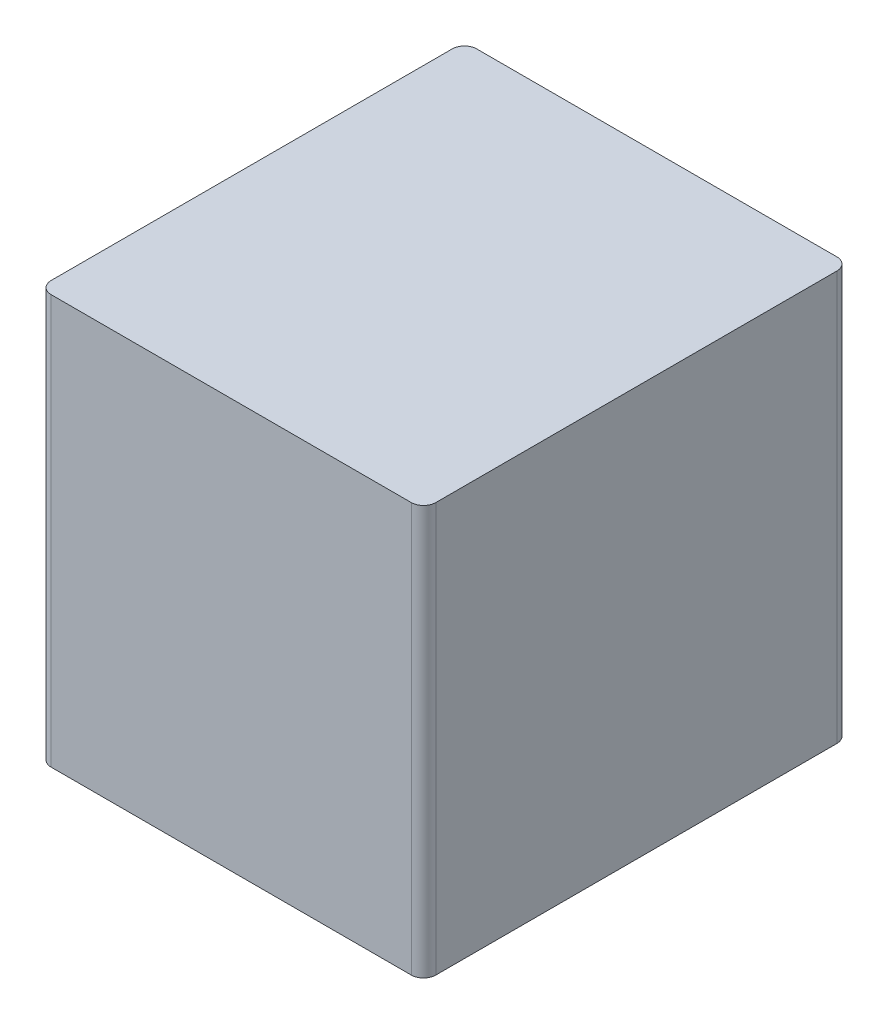
ISO-10303-21;
HEADER;
FILE_DESCRIPTION(('STEP AP214'),'2;1');
FILE_NAME('part.step','',(''),(''),'','','');
FILE_SCHEMA(('AUTOMOTIVE_DESIGN { 1 0 10303 214 1 1 1 1 }'));
ENDSEC;
DATA;
#1=APPLICATION_CONTEXT('core data for automotive mechanical design processes');
#2=APPLICATION_PROTOCOL_DEFINITION('international standard','automotive_design',2000,#1);
#3=PRODUCT_CONTEXT('',#1,'mechanical');
#4=PRODUCT('Part','Part','',(#3));
#5=PRODUCT_RELATED_PRODUCT_CATEGORY('part','',(#4));
#6=PRODUCT_DEFINITION_FORMATION('','',#4);
#7=PRODUCT_DEFINITION_CONTEXT('part definition',#1,'design');
#8=PRODUCT_DEFINITION('design','',#6,#7);
#9=PRODUCT_DEFINITION_SHAPE('','',#8);
#10=(LENGTH_UNIT() NAMED_UNIT(*) SI_UNIT(.MILLI.,.METRE.));
#11=(NAMED_UNIT(*) PLANE_ANGLE_UNIT() SI_UNIT($,.RADIAN.));
#12=(NAMED_UNIT(*) SI_UNIT($,.STERADIAN.) SOLID_ANGLE_UNIT());
#13=UNCERTAINTY_MEASURE_WITH_UNIT(LENGTH_MEASURE(1.E-05),#10,'distance_accuracy_value','');
#14=(GEOMETRIC_REPRESENTATION_CONTEXT(3) GLOBAL_UNCERTAINTY_ASSIGNED_CONTEXT((#13)) GLOBAL_UNIT_ASSIGNED_CONTEXT((#10,
#11,#12)) REPRESENTATION_CONTEXT('',''));
#15=CARTESIAN_POINT('',(0.,0.,0.));
#16=DIRECTION('',(0.,0.,1.));
#17=DIRECTION('',(1.,0.,0.));
#18=AXIS2_PLACEMENT_3D('',#15,#16,#17);
#19=CARTESIAN_POINT('',(10.779999342974,-11.75000065475,-1.641602046084));
#20=DIRECTION('',(-1.19248806385E-08,-0.999999999999996,-8.74227765734797E-08));
#21=DIRECTION('',(0.,8.74227765734797E-08,-0.999999999999996));
#22=AXIS2_PLACEMENT_3D('',#19,#20,#21);
#23=CYLINDRICAL_SURFACE('',#22,0.015);
#24=CARTESIAN_POINT('',(10.779999342974,-11.7500006547487,-1.641602046084));
#25=DIRECTION('',(-1.19248806385E-08,-0.999999999999996,-8.74227765734797E-08));
#26=DIRECTION('',(0.,8.74227765734797E-08,-0.999999999999996));
#27=AXIS2_PLACEMENT_3D('',#24,#25,#26);
#28=CIRCLE('',#27,0.015);
#29=CARTESIAN_POINT('',(10.779999342974,-11.7500006560582,-1.626602046084));
#30=VERTEX_POINT('',#29);
#31=CARTESIAN_POINT('',(10.764999342974,-11.750000654568,-1.64160206794));
#32=VERTEX_POINT('',#31);
#33=EDGE_CURVE('E117',#30,#32,#28,.T.);
#34=ORIENTED_EDGE('',*,*,#33,.T.);
#35=DIRECTION('',(-1.19248806385E-08,-1.,0.));
#36=VECTOR('',#35,1.);
#37=CARTESIAN_POINT('',(10.764999342974,-11.75000065588,-1.641602089796));
#38=LINE('',#37,#36);
#39=CARTESIAN_POINT('',(10.7649993370111,-12.2500006545681,-1.64160208979569));
#40=VERTEX_POINT('',#39);
#41=EDGE_CURVE('E138',#40,#32,#38,.F.);
#42=ORIENTED_EDGE('',*,*,#41,.F.);
#43=CARTESIAN_POINT('',(10.7799993370116,-12.2500006547489,-1.64160208979539));
#44=DIRECTION('',(-1.19248806385E-08,-0.999999999999996,-8.74227765734797E-08));
#45=DIRECTION('',(0.,8.74227765734797E-08,-0.999999999999996));
#46=AXIS2_PLACEMENT_3D('',#43,#44,#45);
#47=CIRCLE('',#46,0.015);
#48=CARTESIAN_POINT('',(10.7799993399925,-12.2500006560583,-1.62660208979554));
#49=VERTEX_POINT('',#48);
#50=EDGE_CURVE('E107',#49,#40,#47,.T.);
#51=ORIENTED_EDGE('',*,*,#50,.F.);
#52=DIRECTION('',(0.,-0.999999999999996,-8.74227765734797E-08));
#53=VECTOR('',#52,1.);
#54=CARTESIAN_POINT('',(10.779999342974,-11.75000066149,-1.626602046084));
#55=LINE('',#54,#53);
#56=EDGE_CURVE('E90',#30,#49,#55,.T.);
#57=ORIENTED_EDGE('',*,*,#56,.F.);
#58=EDGE_LOOP('',(#34,#42,#51,#57));
#59=FACE_BOUND('',#58,.T.);
#60=ADVANCED_FACE('F17',(#59),#23,.T.);
#61=CARTESIAN_POINT('',(10.764999342974,-11.75000065588,-1.626602046084));
#62=DIRECTION('',(-1.,1.19248806385E-08,0.));
#63=DIRECTION('',(-1.19248806385E-08,-1.,0.));
#64=AXIS2_PLACEMENT_3D('',#61,#62,#63);
#65=PLANE('',#64);
#66=DIRECTION('',(-1.19248806385E-08,-0.999999999999996,-8.74227765734797E-08));
#67=VECTOR('',#66,1.);
#68=CARTESIAN_POINT('',(10.764999342974,-11.7500006117311,-2.13160204606461));
#69=LINE('',#68,#67);
#70=CARTESIAN_POINT('',(10.7649993370111,-12.2500006117308,-2.13160208977569));
#71=VERTEX_POINT('',#70);
#72=CARTESIAN_POINT('',(10.764999342974,-11.7500006117295,-2.13160204606431));
#73=VERTEX_POINT('',#72);
#74=EDGE_CURVE('E91',#71,#73,#69,.F.);
#75=ORIENTED_EDGE('',*,*,#74,.F.);
#76=DIRECTION('',(0.,8.74227765734797E-08,-0.999999999999996));
#77=VECTOR('',#76,1.);
#78=CARTESIAN_POINT('',(10.764999337011,-12.2500006331477,-1.886602089803));
#79=LINE('',#78,#77);
#80=EDGE_CURVE('E105',#40,#71,#79,.T.);
#81=ORIENTED_EDGE('',*,*,#80,.F.);
#82=ORIENTED_EDGE('',*,*,#41,.T.);
#83=DIRECTION('',(0.,8.74227765734797E-08,-0.999999999999996));
#84=VECTOR('',#83,1.);
#85=CARTESIAN_POINT('',(10.764999342974,-11.7500006331477,-1.886602046092));
#86=LINE('',#85,#84);
#87=EDGE_CURVE('E124',#32,#73,#86,.T.);
#88=ORIENTED_EDGE('',*,*,#87,.T.);
#89=EDGE_LOOP('',(#75,#81,#82,#88));
#90=FACE_BOUND('',#89,.T.);
#91=ADVANCED_FACE('F182',(#90),#65,.T.);
#92=CARTESIAN_POINT('',(10.779999342974,-11.75000061191,-2.131602046064));
#93=DIRECTION('',(-1.19248806385E-08,-0.999999999999996,-8.74227765734797E-08));
#94=DIRECTION('',(0.,8.74227765734797E-08,-0.999999999999996));
#95=AXIS2_PLACEMENT_3D('',#92,#93,#94);
#96=CYLINDRICAL_SURFACE('',#95,0.015);
#97=CARTESIAN_POINT('',(10.779999342974,-11.7500006119089,-2.131602046064));
#98=DIRECTION('',(-1.19248806385E-08,-0.999999999999996,-8.74227765734797E-08));
#99=DIRECTION('',(0.,8.74227765734797E-08,-0.999999999999996));
#100=AXIS2_PLACEMENT_3D('',#97,#98,#99);
#101=CIRCLE('',#100,0.015);
#102=CARTESIAN_POINT('',(10.7799993399925,-11.7500006105971,-2.146602046064));
#103=VERTEX_POINT('',#102);
#104=EDGE_CURVE('E87',#73,#103,#101,.T.);
#105=ORIENTED_EDGE('',*,*,#104,.T.);
#106=DIRECTION('',(0.,0.999999999999996,8.74227765734797E-08));
#107=VECTOR('',#106,1.);
#108=CARTESIAN_POINT('',(10.779999337011,-11.75000061042,-2.146602046064));
#109=LINE('',#108,#107);
#110=CARTESIAN_POINT('',(10.7799993370113,-12.2500006105983,-2.14660208977585));
#111=VERTEX_POINT('',#110);
#112=EDGE_CURVE('E20',#111,#103,#109,.T.);
#113=ORIENTED_EDGE('',*,*,#112,.F.);
#114=CARTESIAN_POINT('',(10.7799993370116,-12.2500006119113,-2.13160208977539));
#115=DIRECTION('',(-1.19248806385E-08,-0.999999999999996,-8.74227765734797E-08));
#116=DIRECTION('',(0.,8.74227765734797E-08,-0.999999999999996));
#117=AXIS2_PLACEMENT_3D('',#114,#115,#116);
#118=CIRCLE('',#117,0.015);
#119=EDGE_CURVE('E84',#71,#111,#118,.T.);
#120=ORIENTED_EDGE('',*,*,#119,.F.);
#121=ORIENTED_EDGE('',*,*,#74,.T.);
#122=EDGE_LOOP('',(#105,#113,#120,#121));
#123=FACE_BOUND('',#122,.T.);
#124=ADVANCED_FACE('F81',(#123),#96,.T.);
#125=CARTESIAN_POINT('',(10.764999342974,-11.75000061042,-2.146602046064));
#126=DIRECTION('',(0.,8.74227765734797E-08,-0.999999999999996));
#127=DIRECTION('',(0.,0.999999999999996,8.74227765734797E-08));
#128=AXIS2_PLACEMENT_3D('',#125,#126,#127);
#129=PLANE('',#128);
#130=DIRECTION('',(0.,0.999999999999996,8.74227765734797E-08));
#131=VECTOR('',#130,1.);
#132=CARTESIAN_POINT('',(11.219999343003,-11.75000061042,-2.146602046064));
#133=LINE('',#132,#131);
#134=CARTESIAN_POINT('',(11.2199993400218,-12.2500006158467,-2.14660208977585));
#135=VERTEX_POINT('',#134);
#136=CARTESIAN_POINT('',(11.219999343003,-11.7500006158468,-2.146602046064));
#137=VERTEX_POINT('',#136);
#138=EDGE_CURVE('E96',#135,#137,#133,.T.);
#139=ORIENTED_EDGE('',*,*,#138,.F.);
#140=DIRECTION('',(1.,-1.19248806384999E-08,0.));
#141=VECTOR('',#140,1.);
#142=CARTESIAN_POINT('',(10.999999337019,-12.2500006132201,-2.146602089776));
#143=LINE('',#142,#141);
#144=EDGE_CURVE('E93',#111,#135,#143,.T.);
#145=ORIENTED_EDGE('',*,*,#144,.F.);
#146=ORIENTED_EDGE('',*,*,#112,.T.);
#147=DIRECTION('',(1.,-1.19248806384999E-08,0.));
#148=VECTOR('',#147,1.);
#149=CARTESIAN_POINT('',(10.999999342981,-11.7500006132201,-2.146602046064));
#150=LINE('',#149,#148);
#151=EDGE_CURVE('E123',#103,#137,#150,.T.);
#152=ORIENTED_EDGE('',*,*,#151,.T.);
#153=EDGE_LOOP('',(#139,#145,#146,#152));
#154=FACE_BOUND('',#153,.T.);
#155=ADVANCED_FACE('F94',(#154),#129,.T.);
#156=CARTESIAN_POINT('',(11.234999343003,-11.75000066149,-1.626602046084));
#157=DIRECTION('',(0.,-8.74227765734797E-08,0.999999999999996));
#158=DIRECTION('',(0.,-0.999999999999996,-8.74227765734797E-08));
#159=AXIS2_PLACEMENT_3D('',#156,#157,#158);
#160=PLANE('',#159);
#161=DIRECTION('',(-1.19248806385E-08,-0.999999999999996,-8.74227765734797E-08));
#162=VECTOR('',#161,1.);
#163=CARTESIAN_POINT('',(11.219999343003,-11.7500006613113,-1.626602046084));
#164=LINE('',#163,#162);
#165=CARTESIAN_POINT('',(11.219999343003,-11.7500006613079,-1.626602046084));
#166=VERTEX_POINT('',#165);
#167=CARTESIAN_POINT('',(11.2199993370406,-12.2500006613067,-1.62660208979554));
#168=VERTEX_POINT('',#167);
#169=EDGE_CURVE('E113',#166,#168,#164,.T.);
#170=ORIENTED_EDGE('',*,*,#169,.F.);
#171=DIRECTION('',(1.,-1.19248806384999E-08,0.));
#172=VECTOR('',#171,1.);
#173=CARTESIAN_POINT('',(10.999999342981,-11.7500006586799,-1.626602046084));
#174=LINE('',#173,#172);
#175=EDGE_CURVE('E120',#166,#30,#174,.F.);
#176=ORIENTED_EDGE('',*,*,#175,.T.);
#177=ORIENTED_EDGE('',*,*,#56,.T.);
#178=DIRECTION('',(1.,-1.19248806384999E-08,0.));
#179=VECTOR('',#178,1.);
#180=CARTESIAN_POINT('',(10.999999337019,-12.2500006586799,-1.626602089796));
#181=LINE('',#180,#179);
#182=EDGE_CURVE('E139',#168,#49,#181,.F.);
#183=ORIENTED_EDGE('',*,*,#182,.F.);
#184=EDGE_LOOP('',(#170,#176,#177,#183));
#185=FACE_BOUND('',#184,.T.);
#186=ADVANCED_FACE('F158',(#185),#160,.T.);
#187=CARTESIAN_POINT('',(11.219999343003,-11.75000061716,-2.131602046064));
#188=DIRECTION('',(-1.19248806385E-08,-0.999999999999996,-8.74227765734797E-08));
#189=DIRECTION('',(0.,8.74227765734797E-08,-0.999999999999996));
#190=AXIS2_PLACEMENT_3D('',#187,#188,#189);
#191=CYLINDRICAL_SURFACE('',#190,0.015);
#192=CARTESIAN_POINT('',(11.219999343003,-11.7500006171613,-2.131602046064));
#193=DIRECTION('',(-1.19248806385E-08,-0.999999999999996,-8.74227765734797E-08));
#194=DIRECTION('',(0.,8.74227765734797E-08,-0.999999999999996));
#195=AXIS2_PLACEMENT_3D('',#192,#193,#194);
#196=CIRCLE('',#195,0.015);
#197=CARTESIAN_POINT('',(11.234999343003,-11.7500006173401,-2.13160206792));
#198=VERTEX_POINT('',#197);
#199=EDGE_CURVE('E121',#137,#198,#196,.T.);
#200=ORIENTED_EDGE('',*,*,#199,.T.);
#201=DIRECTION('',(1.19248806385E-08,1.,0.));
#202=VECTOR('',#201,1.);
#203=CARTESIAN_POINT('',(11.234999343003,-11.75000061603,-2.131602089776));
#204=LINE('',#203,#202);
#205=CARTESIAN_POINT('',(11.2349993370406,-12.25000063876,-2.13160208977569));
#206=VERTEX_POINT('',#205);
#207=EDGE_CURVE('E140',#206,#198,#204,.T.);
#208=ORIENTED_EDGE('',*,*,#207,.F.);
#209=CARTESIAN_POINT('',(11.2199993370406,-12.2500006171611,-2.13160208977539));
#210=DIRECTION('',(-1.19248806385E-08,-0.999999999999996,-8.74227765734797E-08));
#211=DIRECTION('',(0.,8.74227765734797E-08,-0.999999999999996));
#212=AXIS2_PLACEMENT_3D('',#209,#210,#211);
#213=CIRCLE('',#212,0.015);
#214=EDGE_CURVE('E100',#135,#206,#213,.T.);
#215=ORIENTED_EDGE('',*,*,#214,.F.);
#216=ORIENTED_EDGE('',*,*,#138,.T.);
#217=EDGE_LOOP('',(#200,#208,#215,#216));
#218=FACE_BOUND('',#217,.T.);
#219=ADVANCED_FACE('F156',(#218),#191,.T.);
#220=CARTESIAN_POINT('',(10.999999342981,-11.75000063595,-1.886602046092));
#221=DIRECTION('',(-1.19248806385E-08,-0.999999999999996,-8.74227765734797E-08));
#222=DIRECTION('',(0.,8.74227765734797E-08,-0.999999999999996));
#223=AXIS2_PLACEMENT_3D('',#220,#221,#222);
#224=PLANE('',#223);
#225=ORIENTED_EDGE('',*,*,#175,.F.);
#226=CARTESIAN_POINT('',(11.219999343003,-11.7500006600011,-1.641602046084));
#227=DIRECTION('',(-1.19248806385E-08,-0.999999999999996,-8.74227765734797E-08));
#228=DIRECTION('',(0.,8.74227765734797E-08,-0.999999999999996));
#229=AXIS2_PLACEMENT_3D('',#226,#227,#228);
#230=CIRCLE('',#229,0.015);
#231=CARTESIAN_POINT('',(11.234999343003,-11.75000063876,-1.641602046084));
#232=VERTEX_POINT('',#231);
#233=EDGE_CURVE('E114',#232,#166,#230,.T.);
#234=ORIENTED_EDGE('',*,*,#233,.F.);
#235=DIRECTION('',(0.,0.,1.));
#236=VECTOR('',#235,1.);
#237=CARTESIAN_POINT('',(11.234999343003,-11.75000061734,-2.146602046064));
#238=LINE('',#237,#236);
#239=EDGE_CURVE('E148',#198,#232,#238,.T.);
#240=ORIENTED_EDGE('',*,*,#239,.F.);
#241=ORIENTED_EDGE('',*,*,#199,.F.);
#242=ORIENTED_EDGE('',*,*,#151,.F.);
#243=ORIENTED_EDGE('',*,*,#104,.F.);
#244=ORIENTED_EDGE('',*,*,#87,.F.);
#245=ORIENTED_EDGE('',*,*,#33,.F.);
#246=EDGE_LOOP('',(#225,#234,#240,#241,#242,#243,#244,#245));
#247=FACE_BOUND('',#246,.T.);
#248=ADVANCED_FACE('F154',(#247),#224,.F.);
#249=CARTESIAN_POINT('',(11.219999343003,-11.75000066,-1.641602046084));
#250=DIRECTION('',(-1.19248806385E-08,-0.999999999999996,-8.74227765734797E-08));
#251=DIRECTION('',(0.,8.74227765734797E-08,-0.999999999999996));
#252=AXIS2_PLACEMENT_3D('',#249,#250,#251);
#253=CYLINDRICAL_SURFACE('',#252,0.015);
#254=ORIENTED_EDGE('',*,*,#233,.T.);
#255=ORIENTED_EDGE('',*,*,#169,.T.);
#256=CARTESIAN_POINT('',(11.2199993370406,-12.2500006599987,-1.64160208979539));
#257=DIRECTION('',(-1.19248806385E-08,-0.999999999999996,-8.74227765734797E-08));
#258=DIRECTION('',(0.,8.74227765734797E-08,-0.999999999999996));
#259=AXIS2_PLACEMENT_3D('',#256,#257,#258);
#260=CIRCLE('',#259,0.015);
#261=CARTESIAN_POINT('',(11.2349993370406,-12.2500006601788,-1.64160206794));
#262=VERTEX_POINT('',#261);
#263=EDGE_CURVE('E35',#262,#168,#260,.T.);
#264=ORIENTED_EDGE('',*,*,#263,.F.);
#265=DIRECTION('',(1.19248806385E-08,1.,0.));
#266=VECTOR('',#265,1.);
#267=CARTESIAN_POINT('',(11.234999343003,-11.75000061603,-1.641602046084));
#268=LINE('',#267,#266);
#269=EDGE_CURVE('E26',#232,#262,#268,.F.);
#270=ORIENTED_EDGE('',*,*,#269,.F.);
#271=EDGE_LOOP('',(#254,#255,#264,#270));
#272=FACE_BOUND('',#271,.T.);
#273=ADVANCED_FACE('F165',(#272),#253,.T.);
#274=CARTESIAN_POINT('',(10.999999337019,-12.25000063595,-1.886602089803));
#275=DIRECTION('',(-1.19248806385E-08,-0.999999999999996,-8.74227765734797E-08));
#276=DIRECTION('',(0.,8.74227765734797E-08,-0.999999999999996));
#277=AXIS2_PLACEMENT_3D('',#274,#275,#276);
#278=PLANE('',#277);
#279=ORIENTED_EDGE('',*,*,#263,.T.);
#280=ORIENTED_EDGE('',*,*,#182,.T.);
#281=ORIENTED_EDGE('',*,*,#50,.T.);
#282=ORIENTED_EDGE('',*,*,#80,.T.);
#283=ORIENTED_EDGE('',*,*,#119,.T.);
#284=ORIENTED_EDGE('',*,*,#144,.T.);
#285=ORIENTED_EDGE('',*,*,#214,.T.);
#286=DIRECTION('',(0.,0.,1.));
#287=VECTOR('',#286,1.);
#288=CARTESIAN_POINT('',(11.2349993370406,-12.25000066018,-2.146602046064));
#289=LINE('',#288,#287);
#290=EDGE_CURVE('E11',#262,#206,#289,.F.);
#291=ORIENTED_EDGE('',*,*,#290,.F.);
#292=EDGE_LOOP('',(#279,#280,#281,#282,#283,#284,#285,#291));
#293=FACE_BOUND('',#292,.T.);
#294=ADVANCED_FACE('F102',(#293),#278,.T.);
#295=CARTESIAN_POINT('',(11.234999343003,-11.75000061603,-2.146602046064));
#296=DIRECTION('',(1.,-1.19248806385E-08,0.));
#297=DIRECTION('',(1.19248806385E-08,1.,0.));
#298=AXIS2_PLACEMENT_3D('',#295,#296,#297);
#299=PLANE('',#298);
#300=ORIENTED_EDGE('',*,*,#269,.T.);
#301=ORIENTED_EDGE('',*,*,#290,.T.);
#302=ORIENTED_EDGE('',*,*,#207,.T.);
#303=ORIENTED_EDGE('',*,*,#239,.T.);
#304=EDGE_LOOP('',(#300,#301,#302,#303));
#305=FACE_BOUND('',#304,.T.);
#306=ADVANCED_FACE('F145',(#305),#299,.T.);
#307=CLOSED_SHELL('',(#60,#91,#124,#155,#186,#219,#248,#273,#294,#306));
#308=MANIFOLD_SOLID_BREP('B1',#307);
#309=ADVANCED_BREP_SHAPE_REPRESENTATION('',(#18,#308),#14);
#310=SHAPE_DEFINITION_REPRESENTATION(#9,#309);
ENDSEC;
END-ISO-10303-21;
